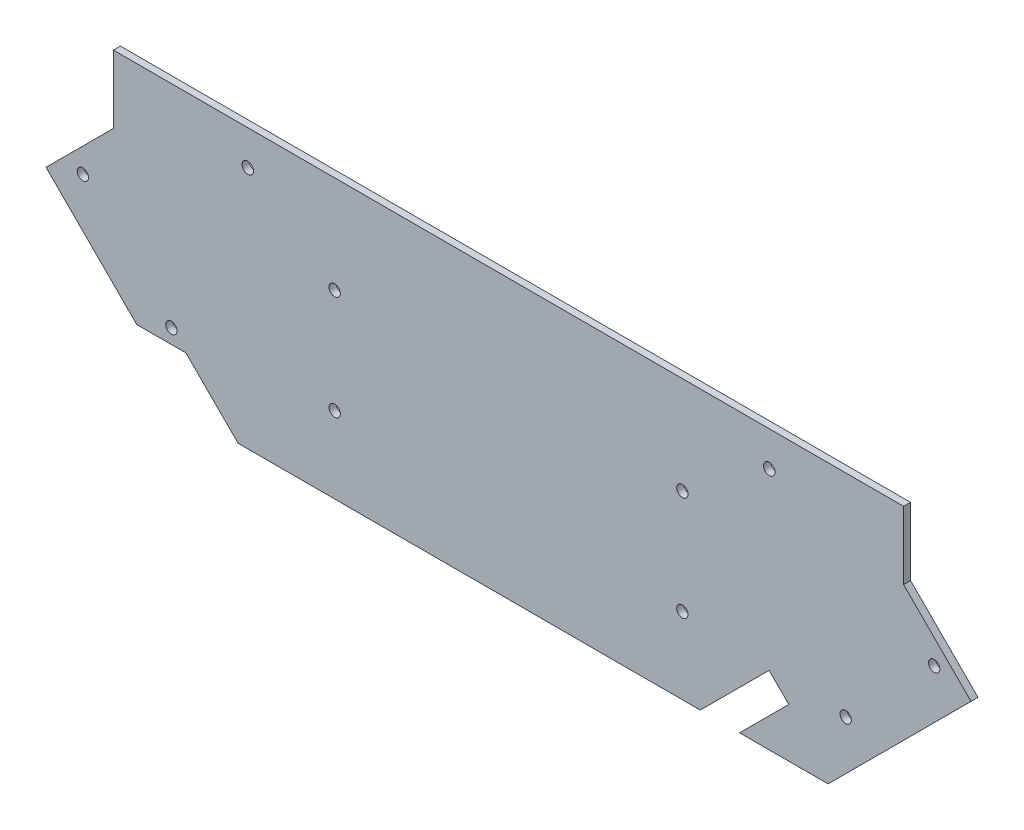
ISO-10303-21;
HEADER;
FILE_DESCRIPTION(('STEP AP214'),'2;1');
FILE_NAME('part.step','',(''),(''),'','','');
FILE_SCHEMA(('AUTOMOTIVE_DESIGN { 1 0 10303 214 1 1 1 1 }'));
ENDSEC;
DATA;
#1=APPLICATION_CONTEXT('core data for automotive mechanical design processes');
#2=APPLICATION_PROTOCOL_DEFINITION('international standard','automotive_design',2000,#1);
#3=PRODUCT_CONTEXT('',#1,'mechanical');
#4=PRODUCT('Part','Part','',(#3));
#5=PRODUCT_RELATED_PRODUCT_CATEGORY('part','',(#4));
#6=PRODUCT_DEFINITION_FORMATION('','',#4);
#7=PRODUCT_DEFINITION_CONTEXT('part definition',#1,'design');
#8=PRODUCT_DEFINITION('design','',#6,#7);
#9=PRODUCT_DEFINITION_SHAPE('','',#8);
#10=(LENGTH_UNIT() NAMED_UNIT(*) SI_UNIT(.MILLI.,.METRE.));
#11=(NAMED_UNIT(*) PLANE_ANGLE_UNIT() SI_UNIT($,.RADIAN.));
#12=(NAMED_UNIT(*) SI_UNIT($,.STERADIAN.) SOLID_ANGLE_UNIT());
#13=UNCERTAINTY_MEASURE_WITH_UNIT(LENGTH_MEASURE(1.E-05),#10,'distance_accuracy_value','');
#14=(GEOMETRIC_REPRESENTATION_CONTEXT(3) GLOBAL_UNCERTAINTY_ASSIGNED_CONTEXT((#13)) GLOBAL_UNIT_ASSIGNED_CONTEXT((#10,
#11,#12)) REPRESENTATION_CONTEXT('',''));
#15=CARTESIAN_POINT('',(0.,0.,0.));
#16=DIRECTION('',(0.,0.,1.));
#17=DIRECTION('',(1.,0.,0.));
#18=AXIS2_PLACEMENT_3D('',#15,#16,#17);
#19=CARTESIAN_POINT('',(63.63,-40.,2.));
#20=DIRECTION('',(0.,1.,0.));
#21=DIRECTION('',(-1.,0.,0.));
#22=AXIS2_PLACEMENT_3D('',#19,#20,#21);
#23=PLANE('',#22);
#24=DIRECTION('',(1.,0.,0.));
#25=VECTOR('',#24,1.);
#26=CARTESIAN_POINT('',(63.63,-40.,2.));
#27=LINE('',#26,#25);
#28=CARTESIAN_POINT('',(66.4584271247462,-40.0000000000003,2.));
#29=VERTEX_POINT('',#28);
#30=CARTESIAN_POINT('',(91.9142712474619,-40.,2.));
#31=VERTEX_POINT('',#30);
#32=EDGE_CURVE('E174',#29,#31,#27,.T.);
#33=ORIENTED_EDGE('',*,*,#32,.F.);
#34=DIRECTION('',(0.,0.,1.));
#35=VECTOR('',#34,1.);
#36=CARTESIAN_POINT('',(66.4584271247462,-40.0000000000003,-30.));
#37=LINE('',#36,#35);
#38=CARTESIAN_POINT('',(66.4584271247462,-40.0000000000003,0.));
#39=VERTEX_POINT('',#38);
#40=EDGE_CURVE('E291',#39,#29,#37,.T.);
#41=ORIENTED_EDGE('',*,*,#40,.F.);
#42=DIRECTION('',(1.,0.,0.));
#43=VECTOR('',#42,1.);
#44=CARTESIAN_POINT('',(63.63,-40.,0.));
#45=LINE('',#44,#43);
#46=CARTESIAN_POINT('',(91.9142712474619,-40.,0.));
#47=VERTEX_POINT('',#46);
#48=EDGE_CURVE('E178',#39,#47,#45,.T.);
#49=ORIENTED_EDGE('',*,*,#48,.T.);
#50=DIRECTION('',(0.,0.,-1.));
#51=VECTOR('',#50,1.);
#52=CARTESIAN_POINT('',(91.9142712474619,-40.,125.542469215234));
#53=LINE('',#52,#51);
#54=EDGE_CURVE('E241',#31,#47,#53,.T.);
#55=ORIENTED_EDGE('',*,*,#54,.F.);
#56=EDGE_LOOP('',(#33,#41,#49,#55));
#57=FACE_BOUND('',#56,.T.);
#58=ADVANCED_FACE('F36',(#57),#23,.F.);
#59=CARTESIAN_POINT('',(-77.772135623731,-40.,2.));
#60=VERTEX_POINT('',#59);
#61=CARTESIAN_POINT('',(55.1447186257614,-40.0000000000002,2.));
#62=VERTEX_POINT('',#61);
#63=EDGE_CURVE('E169',#60,#62,#27,.T.);
#64=ORIENTED_EDGE('',*,*,#63,.F.);
#65=DIRECTION('',(0.,0.,1.));
#66=VECTOR('',#65,1.);
#67=CARTESIAN_POINT('',(-77.772135623731,-40.,-30.));
#68=LINE('',#67,#66);
#69=CARTESIAN_POINT('',(-77.772135623731,-40.,0.));
#70=VERTEX_POINT('',#69);
#71=EDGE_CURVE('E276',#70,#60,#68,.T.);
#72=ORIENTED_EDGE('',*,*,#71,.F.);
#73=CARTESIAN_POINT('',(55.1447186257614,-40.0000000000002,0.));
#74=VERTEX_POINT('',#73);
#75=EDGE_CURVE('E180',#70,#74,#45,.T.);
#76=ORIENTED_EDGE('',*,*,#75,.T.);
#77=DIRECTION('',(0.,0.,1.));
#78=VECTOR('',#77,1.);
#79=CARTESIAN_POINT('',(55.1447186257614,-40.0000000000002,-30.));
#80=LINE('',#79,#78);
#81=EDGE_CURVE('E311',#74,#62,#80,.T.);
#82=ORIENTED_EDGE('',*,*,#81,.T.);
#83=EDGE_LOOP('',(#64,#72,#76,#82));
#84=FACE_BOUND('',#83,.T.);
#85=ADVANCED_FACE('F38',(#84),#23,.F.);
#86=CARTESIAN_POINT('',(63.63,40.,2.));
#87=DIRECTION('',(0.,-1.,0.));
#88=DIRECTION('',(1.,0.,0.));
#89=AXIS2_PLACEMENT_3D('',#86,#87,#88);
#90=PLANE('',#89);
#91=DIRECTION('',(-1.,0.,0.));
#92=VECTOR('',#91,1.);
#93=CARTESIAN_POINT('',(63.63,40.,2.));
#94=LINE('',#93,#92);
#95=CARTESIAN_POINT('',(113.63,40.,2.));
#96=VERTEX_POINT('',#95);
#97=CARTESIAN_POINT('',(-113.63,40.,2.));
#98=VERTEX_POINT('',#97);
#99=EDGE_CURVE('E157',#96,#98,#94,.T.);
#100=ORIENTED_EDGE('',*,*,#99,.F.);
#101=DIRECTION('',(0.,0.,1.));
#102=VECTOR('',#101,1.);
#103=CARTESIAN_POINT('',(113.63,40.,-30.));
#104=LINE('',#103,#102);
#105=CARTESIAN_POINT('',(113.63,40.,0.));
#106=VERTEX_POINT('',#105);
#107=EDGE_CURVE('E299',#106,#96,#104,.T.);
#108=ORIENTED_EDGE('',*,*,#107,.F.);
#109=DIRECTION('',(-1.,0.,0.));
#110=VECTOR('',#109,1.);
#111=CARTESIAN_POINT('',(63.63,40.,0.));
#112=LINE('',#111,#110);
#113=CARTESIAN_POINT('',(-113.63,40.,0.));
#114=VERTEX_POINT('',#113);
#115=EDGE_CURVE('E159',#106,#114,#112,.T.);
#116=ORIENTED_EDGE('',*,*,#115,.T.);
#117=DIRECTION('',(0.,0.,1.));
#118=VECTOR('',#117,1.);
#119=CARTESIAN_POINT('',(-113.63,40.,-30.));
#120=LINE('',#119,#118);
#121=EDGE_CURVE('E142',#114,#98,#120,.T.);
#122=ORIENTED_EDGE('',*,*,#121,.T.);
#123=EDGE_LOOP('',(#100,#108,#116,#122));
#124=FACE_BOUND('',#123,.T.);
#125=ADVANCED_FACE('F155',(#124),#90,.F.);
#126=CARTESIAN_POINT('',(0.,0.,2.));
#127=DIRECTION('',(0.,0.,1.));
#128=DIRECTION('',(1.,0.,0.));
#129=AXIS2_PLACEMENT_3D('',#126,#127,#128);
#130=PLANE('',#129);
#131=CARTESIAN_POINT('',(122.416796564404,4.64466094067265,2.));
#132=DIRECTION('',(0.,0.,1.));
#133=DIRECTION('',(-1.,0.,0.));
#134=AXIS2_PLACEMENT_3D('',#131,#132,#133);
#135=CIRCLE('',#134,1.62499999999997);
#136=CARTESIAN_POINT('',(120.791796564404,4.64466094067265,2.));
#137=VERTEX_POINT('',#136);
#138=EDGE_CURVE('E287',#137,#137,#135,.T.);
#139=ORIENTED_EDGE('',*,*,#138,.F.);
#140=EDGE_LOOP('',(#139));
#141=FACE_BOUND('',#140,.T.);
#142=CARTESIAN_POINT('',(96.9609524416879,-20.8111831820431,2.));
#143=DIRECTION('',(0.,0.,1.));
#144=DIRECTION('',(-1.,0.,0.));
#145=AXIS2_PLACEMENT_3D('',#142,#143,#144);
#146=CIRCLE('',#145,1.625);
#147=CARTESIAN_POINT('',(95.3359524416879,-20.8111831820431,2.));
#148=VERTEX_POINT('',#147);
#149=EDGE_CURVE('E290',#148,#148,#146,.T.);
#150=ORIENTED_EDGE('',*,*,#149,.F.);
#151=EDGE_LOOP('',(#150));
#152=FACE_BOUND('',#151,.T.);
#153=CARTESIAN_POINT('',(-122.416796564404,4.64466094067262,2.));
#154=DIRECTION('',(0.,0.,1.));
#155=DIRECTION('',(1.,0.,0.));
#156=AXIS2_PLACEMENT_3D('',#153,#154,#155);
#157=CIRCLE('',#156,1.62499999999997);
#158=CARTESIAN_POINT('',(-120.791796564404,4.64466094067262,2.));
#159=VERTEX_POINT('',#158);
#160=EDGE_CURVE('E294',#159,#159,#157,.T.);
#161=ORIENTED_EDGE('',*,*,#160,.F.);
#162=EDGE_LOOP('',(#161));
#163=FACE_BOUND('',#162,.T.);
#164=CARTESIAN_POINT('',(-96.9609524416879,-20.8111831820431,2.));
#165=DIRECTION('',(0.,0.,1.));
#166=DIRECTION('',(1.,0.,0.));
#167=AXIS2_PLACEMENT_3D('',#164,#165,#166);
#168=CIRCLE('',#167,1.625);
#169=CARTESIAN_POINT('',(-95.3359524416879,-20.8111831820431,2.));
#170=VERTEX_POINT('',#169);
#171=EDGE_CURVE('E284',#170,#170,#168,.T.);
#172=ORIENTED_EDGE('',*,*,#171,.F.);
#173=EDGE_LOOP('',(#172));
#174=FACE_BOUND('',#173,.T.);
#175=CARTESIAN_POINT('',(-50.,-18.,2.));
#176=DIRECTION('',(0.,0.,1.));
#177=DIRECTION('',(1.,0.,0.));
#178=AXIS2_PLACEMENT_3D('',#175,#176,#177);
#179=CIRCLE('',#178,1.625);
#180=CARTESIAN_POINT('',(-48.375,-18.,2.));
#181=VERTEX_POINT('',#180);
#182=EDGE_CURVE('E269',#181,#181,#179,.T.);
#183=ORIENTED_EDGE('',*,*,#182,.F.);
#184=EDGE_LOOP('',(#183));
#185=FACE_BOUND('',#184,.T.);
#186=CARTESIAN_POINT('',(50.,12.,2.));
#187=DIRECTION('',(0.,0.,1.));
#188=DIRECTION('',(1.,0.,0.));
#189=AXIS2_PLACEMENT_3D('',#186,#187,#188);
#190=CIRCLE('',#189,1.625);
#191=CARTESIAN_POINT('',(51.625,12.,2.));
#192=VERTEX_POINT('',#191);
#193=EDGE_CURVE('E270',#192,#192,#190,.T.);
#194=ORIENTED_EDGE('',*,*,#193,.F.);
#195=EDGE_LOOP('',(#194));
#196=FACE_BOUND('',#195,.T.);
#197=CARTESIAN_POINT('',(50.,-18.,2.));
#198=DIRECTION('',(0.,0.,1.));
#199=DIRECTION('',(1.,0.,0.));
#200=AXIS2_PLACEMENT_3D('',#197,#198,#199);
#201=CIRCLE('',#200,1.625);
#202=CARTESIAN_POINT('',(51.625,-18.,2.));
#203=VERTEX_POINT('',#202);
#204=EDGE_CURVE('E273',#203,#203,#201,.T.);
#205=ORIENTED_EDGE('',*,*,#204,.F.);
#206=EDGE_LOOP('',(#205));
#207=FACE_BOUND('',#206,.T.);
#208=DIRECTION('',(-1.,0.,0.));
#209=VECTOR('',#208,1.);
#210=CARTESIAN_POINT('',(-106.914271247462,-25.,2.));
#211=LINE('',#210,#209);
#212=CARTESIAN_POINT('',(-92.772135623731,-25.,2.));
#213=VERTEX_POINT('',#212);
#214=CARTESIAN_POINT('',(-106.914271247462,-25.,2.));
#215=VERTEX_POINT('',#214);
#216=EDGE_CURVE('E252',#213,#215,#211,.T.);
#217=ORIENTED_EDGE('',*,*,#216,.F.);
#218=DIRECTION('',(-0.707106781186548,0.707106781186547,0.));
#219=VECTOR('',#218,1.);
#220=CARTESIAN_POINT('',(-92.772135623731,-25.,2.));
#221=LINE('',#220,#219);
#222=EDGE_CURVE('E281',#60,#213,#221,.T.);
#223=ORIENTED_EDGE('',*,*,#222,.F.);
#224=ORIENTED_EDGE('',*,*,#63,.T.);
#225=DIRECTION('',(-0.707106781186551,-0.707106781186544,0.));
#226=VECTOR('',#225,1.);
#227=CARTESIAN_POINT('',(74.9437084989848,-20.201010126777,2.));
#228=LINE('',#227,#226);
#229=CARTESIAN_POINT('',(74.9437084989848,-20.201010126777,2.));
#230=VERTEX_POINT('',#229);
#231=EDGE_CURVE('E309',#230,#62,#228,.T.);
#232=ORIENTED_EDGE('',*,*,#231,.F.);
#233=DIRECTION('',(-0.707106781186543,0.707106781186552,0.));
#234=VECTOR('',#233,1.);
#235=CARTESIAN_POINT('',(80.6005627484772,-25.8578643762694,2.));
#236=LINE('',#235,#234);
#237=CARTESIAN_POINT('',(80.6005627484772,-25.8578643762694,2.));
#238=VERTEX_POINT('',#237);
#239=EDGE_CURVE('E316',#238,#230,#236,.T.);
#240=ORIENTED_EDGE('',*,*,#239,.F.);
#241=DIRECTION('',(0.707106781186551,0.707106781186544,0.));
#242=VECTOR('',#241,1.);
#243=CARTESIAN_POINT('',(66.4584271247462,-40.0000000000003,2.));
#244=LINE('',#243,#242);
#245=EDGE_CURVE('E304',#29,#238,#244,.T.);
#246=ORIENTED_EDGE('',*,*,#245,.F.);
#247=ORIENTED_EDGE('',*,*,#32,.T.);
#248=DIRECTION('',(-0.707106781186548,-0.707106781186547,0.));
#249=VECTOR('',#248,1.);
#250=CARTESIAN_POINT('',(65.9571356237309,-65.9571356237309,2.));
#251=LINE('',#250,#249);
#252=CARTESIAN_POINT('',(133.023398282202,1.10912703473992,2.));
#253=VERTEX_POINT('',#252);
#254=EDGE_CURVE('E233',#253,#31,#251,.T.);
#255=ORIENTED_EDGE('',*,*,#254,.F.);
#256=DIRECTION('',(0.707106781186548,-0.707106781186548,0.));
#257=VECTOR('',#256,1.);
#258=CARTESIAN_POINT('',(133.023398282202,1.10912703473992,2.));
#259=LINE('',#258,#257);
#260=CARTESIAN_POINT('',(113.63,20.5025253169417,2.));
#261=VERTEX_POINT('',#260);
#262=EDGE_CURVE('E302',#261,#253,#259,.T.);
#263=ORIENTED_EDGE('',*,*,#262,.F.);
#264=DIRECTION('',(0.,-1.,0.));
#265=VECTOR('',#264,1.);
#266=CARTESIAN_POINT('',(113.63,20.5025253169417,2.));
#267=LINE('',#266,#265);
#268=EDGE_CURVE('E167',#96,#261,#267,.T.);
#269=ORIENTED_EDGE('',*,*,#268,.F.);
#270=ORIENTED_EDGE('',*,*,#99,.T.);
#271=DIRECTION('',(0.,1.,0.));
#272=VECTOR('',#271,1.);
#273=CARTESIAN_POINT('',(-113.63,20.5025253169417,2.));
#274=LINE('',#273,#272);
#275=CARTESIAN_POINT('',(-113.63,20.5025253169417,2.));
#276=VERTEX_POINT('',#275);
#277=EDGE_CURVE('E139',#276,#98,#274,.T.);
#278=ORIENTED_EDGE('',*,*,#277,.F.);
#279=DIRECTION('',(0.707106781186548,0.707106781186548,0.));
#280=VECTOR('',#279,1.);
#281=CARTESIAN_POINT('',(-133.023398282202,1.10912703473989,2.));
#282=LINE('',#281,#280);
#283=CARTESIAN_POINT('',(-133.023398282202,1.10912703473989,2.));
#284=VERTEX_POINT('',#283);
#285=EDGE_CURVE('E149',#284,#276,#282,.T.);
#286=ORIENTED_EDGE('',*,*,#285,.F.);
#287=DIRECTION('',(0.707106781186548,-0.707106781186548,0.));
#288=VECTOR('',#287,1.);
#289=CARTESIAN_POINT('',(-65.957135623731,-65.957135623731,2.));
#290=LINE('',#289,#288);
#291=EDGE_CURVE('E181',#284,#215,#290,.T.);
#292=ORIENTED_EDGE('',*,*,#291,.T.);
#293=EDGE_LOOP('',(#217,#223,#224,#232,#240,#246,#247,#255,#263,#269,#270,#278,#286,#292));
#294=FACE_BOUND('',#293,.T.);
#295=CARTESIAN_POINT('',(-75.,30.,2.));
#296=DIRECTION('',(0.,0.,1.));
#297=DIRECTION('',(1.,0.,0.));
#298=AXIS2_PLACEMENT_3D('',#295,#296,#297);
#299=CIRCLE('',#298,1.65);
#300=CARTESIAN_POINT('',(-73.35,30.,2.));
#301=VERTEX_POINT('',#300);
#302=EDGE_CURVE('E321',#301,#301,#299,.T.);
#303=ORIENTED_EDGE('',*,*,#302,.F.);
#304=EDGE_LOOP('',(#303));
#305=FACE_BOUND('',#304,.T.);
#306=CARTESIAN_POINT('',(75.,30.,2.));
#307=DIRECTION('',(0.,0.,1.));
#308=DIRECTION('',(1.,0.,0.));
#309=AXIS2_PLACEMENT_3D('',#306,#307,#308);
#310=CIRCLE('',#309,1.65);
#311=CARTESIAN_POINT('',(76.65,30.,2.));
#312=VERTEX_POINT('',#311);
#313=EDGE_CURVE('E150',#312,#312,#310,.T.);
#314=ORIENTED_EDGE('',*,*,#313,.F.);
#315=EDGE_LOOP('',(#314));
#316=FACE_BOUND('',#315,.T.);
#317=CARTESIAN_POINT('',(-50.,12.,2.));
#318=DIRECTION('',(0.,0.,1.));
#319=DIRECTION('',(1.,0.,0.));
#320=AXIS2_PLACEMENT_3D('',#317,#318,#319);
#321=CIRCLE('',#320,1.625);
#322=CARTESIAN_POINT('',(-48.375,12.,2.));
#323=VERTEX_POINT('',#322);
#324=EDGE_CURVE('E264',#323,#323,#321,.T.);
#325=ORIENTED_EDGE('',*,*,#324,.F.);
#326=EDGE_LOOP('',(#325));
#327=FACE_BOUND('',#326,.T.);
#328=ADVANCED_FACE('F163',(#141,#152,#163,#174,#185,#196,#207,#294,#305,#316,#327),#130,.T.);
#329=CARTESIAN_POINT('',(0.,0.,0.));
#330=DIRECTION('',(0.,0.,1.));
#331=DIRECTION('',(1.,0.,0.));
#332=AXIS2_PLACEMENT_3D('',#329,#330,#331);
#333=PLANE('',#332);
#334=CARTESIAN_POINT('',(122.416796564404,4.64466094067265,0.));
#335=DIRECTION('',(0.,0.,1.));
#336=DIRECTION('',(1.,0.,0.));
#337=AXIS2_PLACEMENT_3D('',#334,#335,#336);
#338=CIRCLE('',#337,1.62499999999997);
#339=CARTESIAN_POINT('',(124.041796564404,4.64466094067265,0.));
#340=VERTEX_POINT('',#339);
#341=EDGE_CURVE('E40',#340,#340,#338,.T.);
#342=ORIENTED_EDGE('',*,*,#341,.T.);
#343=EDGE_LOOP('',(#342));
#344=FACE_BOUND('',#343,.T.);
#345=CARTESIAN_POINT('',(96.9609524416879,-20.8111831820431,0.));
#346=DIRECTION('',(0.,0.,1.));
#347=DIRECTION('',(1.,0.,0.));
#348=AXIS2_PLACEMENT_3D('',#345,#346,#347);
#349=CIRCLE('',#348,1.625);
#350=CARTESIAN_POINT('',(98.5859524416879,-20.8111831820431,0.));
#351=VERTEX_POINT('',#350);
#352=EDGE_CURVE('E224',#351,#351,#349,.T.);
#353=ORIENTED_EDGE('',*,*,#352,.T.);
#354=EDGE_LOOP('',(#353));
#355=FACE_BOUND('',#354,.T.);
#356=CARTESIAN_POINT('',(-122.416796564404,4.64466094067262,0.));
#357=DIRECTION('',(0.,0.,1.));
#358=DIRECTION('',(1.,0.,0.));
#359=AXIS2_PLACEMENT_3D('',#356,#357,#358);
#360=CIRCLE('',#359,1.62499999999997);
#361=CARTESIAN_POINT('',(-120.791796564404,4.64466094067262,0.));
#362=VERTEX_POINT('',#361);
#363=EDGE_CURVE('E222',#362,#362,#360,.T.);
#364=ORIENTED_EDGE('',*,*,#363,.T.);
#365=EDGE_LOOP('',(#364));
#366=FACE_BOUND('',#365,.T.);
#367=CARTESIAN_POINT('',(-96.9609524416879,-20.8111831820431,0.));
#368=DIRECTION('',(0.,0.,1.));
#369=DIRECTION('',(1.,0.,0.));
#370=AXIS2_PLACEMENT_3D('',#367,#368,#369);
#371=CIRCLE('',#370,1.625);
#372=CARTESIAN_POINT('',(-95.3359524416879,-20.8111831820431,0.));
#373=VERTEX_POINT('',#372);
#374=EDGE_CURVE('E219',#373,#373,#371,.T.);
#375=ORIENTED_EDGE('',*,*,#374,.T.);
#376=EDGE_LOOP('',(#375));
#377=FACE_BOUND('',#376,.T.);
#378=CARTESIAN_POINT('',(-50.,-18.,0.));
#379=DIRECTION('',(0.,0.,1.));
#380=DIRECTION('',(1.,0.,0.));
#381=AXIS2_PLACEMENT_3D('',#378,#379,#380);
#382=CIRCLE('',#381,1.625);
#383=CARTESIAN_POINT('',(-48.375,-18.,0.));
#384=VERTEX_POINT('',#383);
#385=EDGE_CURVE('E216',#384,#384,#382,.T.);
#386=ORIENTED_EDGE('',*,*,#385,.T.);
#387=EDGE_LOOP('',(#386));
#388=FACE_BOUND('',#387,.T.);
#389=CARTESIAN_POINT('',(50.,12.,0.));
#390=DIRECTION('',(0.,0.,1.));
#391=DIRECTION('',(1.,0.,0.));
#392=AXIS2_PLACEMENT_3D('',#389,#390,#391);
#393=CIRCLE('',#392,1.625);
#394=CARTESIAN_POINT('',(51.625,12.,0.));
#395=VERTEX_POINT('',#394);
#396=EDGE_CURVE('E213',#395,#395,#393,.T.);
#397=ORIENTED_EDGE('',*,*,#396,.T.);
#398=EDGE_LOOP('',(#397));
#399=FACE_BOUND('',#398,.T.);
#400=CARTESIAN_POINT('',(50.,-18.,0.));
#401=DIRECTION('',(0.,0.,1.));
#402=DIRECTION('',(1.,0.,0.));
#403=AXIS2_PLACEMENT_3D('',#400,#401,#402);
#404=CIRCLE('',#403,1.625);
#405=CARTESIAN_POINT('',(51.625,-18.,0.));
#406=VERTEX_POINT('',#405);
#407=EDGE_CURVE('E209',#406,#406,#404,.T.);
#408=ORIENTED_EDGE('',*,*,#407,.T.);
#409=EDGE_LOOP('',(#408));
#410=FACE_BOUND('',#409,.T.);
#411=CARTESIAN_POINT('',(-75.,30.,0.));
#412=DIRECTION('',(0.,0.,1.));
#413=DIRECTION('',(1.,0.,0.));
#414=AXIS2_PLACEMENT_3D('',#411,#412,#413);
#415=CIRCLE('',#414,1.65);
#416=CARTESIAN_POINT('',(-73.35,30.,0.));
#417=VERTEX_POINT('',#416);
#418=EDGE_CURVE('E195',#417,#417,#415,.T.);
#419=ORIENTED_EDGE('',*,*,#418,.T.);
#420=EDGE_LOOP('',(#419));
#421=FACE_BOUND('',#420,.T.);
#422=DIRECTION('',(-0.707106781186548,0.707106781186547,0.));
#423=VECTOR('',#422,1.);
#424=CARTESIAN_POINT('',(-58.8860678118655,-58.8860678118655,0.));
#425=LINE('',#424,#423);
#426=CARTESIAN_POINT('',(-92.772135623731,-25.,0.));
#427=VERTEX_POINT('',#426);
#428=EDGE_CURVE('E11',#70,#427,#425,.T.);
#429=ORIENTED_EDGE('',*,*,#428,.T.);
#430=DIRECTION('',(-1.,0.,0.));
#431=VECTOR('',#430,1.);
#432=CARTESIAN_POINT('',(0.,-25.0000000000001,0.));
#433=LINE('',#432,#431);
#434=CARTESIAN_POINT('',(-106.914271247462,-25.,0.));
#435=VERTEX_POINT('',#434);
#436=EDGE_CURVE('E192',#427,#435,#433,.T.);
#437=ORIENTED_EDGE('',*,*,#436,.T.);
#438=DIRECTION('',(0.707106781186548,-0.707106781186548,0.));
#439=VECTOR('',#438,1.);
#440=CARTESIAN_POINT('',(-65.957135623731,-65.957135623731,0.));
#441=LINE('',#440,#439);
#442=CARTESIAN_POINT('',(-133.023398282202,1.10912703473989,0.));
#443=VERTEX_POINT('',#442);
#444=EDGE_CURVE('E247',#443,#435,#441,.T.);
#445=ORIENTED_EDGE('',*,*,#444,.F.);
#446=DIRECTION('',(0.707106781186547,0.707106781186548,0.));
#447=VECTOR('',#446,1.);
#448=CARTESIAN_POINT('',(-67.0662626584709,67.0662626584709,0.));
#449=LINE('',#448,#447);
#450=CARTESIAN_POINT('',(-113.63,20.5025253169417,0.));
#451=VERTEX_POINT('',#450);
#452=EDGE_CURVE('E61',#443,#451,#449,.T.);
#453=ORIENTED_EDGE('',*,*,#452,.T.);
#454=DIRECTION('',(0.,1.,0.));
#455=VECTOR('',#454,1.);
#456=CARTESIAN_POINT('',(-113.63,0.,0.));
#457=LINE('',#456,#455);
#458=EDGE_CURVE('E187',#451,#114,#457,.T.);
#459=ORIENTED_EDGE('',*,*,#458,.T.);
#460=ORIENTED_EDGE('',*,*,#115,.F.);
#461=DIRECTION('',(0.,-1.,0.));
#462=VECTOR('',#461,1.);
#463=CARTESIAN_POINT('',(113.63,0.,0.));
#464=LINE('',#463,#462);
#465=CARTESIAN_POINT('',(113.63,20.5025253169417,0.));
#466=VERTEX_POINT('',#465);
#467=EDGE_CURVE('E197',#106,#466,#464,.T.);
#468=ORIENTED_EDGE('',*,*,#467,.T.);
#469=DIRECTION('',(0.707106781186548,-0.707106781186548,0.));
#470=VECTOR('',#469,1.);
#471=CARTESIAN_POINT('',(67.0662626584709,67.0662626584709,0.));
#472=LINE('',#471,#470);
#473=CARTESIAN_POINT('',(133.023398282202,1.10912703473992,0.));
#474=VERTEX_POINT('',#473);
#475=EDGE_CURVE('E263',#466,#474,#472,.T.);
#476=ORIENTED_EDGE('',*,*,#475,.T.);
#477=DIRECTION('',(-0.707106781186548,-0.707106781186547,0.));
#478=VECTOR('',#477,1.);
#479=CARTESIAN_POINT('',(65.9571356237309,-65.9571356237309,0.));
#480=LINE('',#479,#478);
#481=EDGE_CURVE('E229',#474,#47,#480,.T.);
#482=ORIENTED_EDGE('',*,*,#481,.T.);
#483=ORIENTED_EDGE('',*,*,#48,.F.);
#484=DIRECTION('',(0.707106781186551,0.707106781186544,0.));
#485=VECTOR('',#484,1.);
#486=CARTESIAN_POINT('',(53.2292135623729,-53.2292135623734,0.));
#487=LINE('',#486,#485);
#488=CARTESIAN_POINT('',(80.6005627484772,-25.8578643762694,0.));
#489=VERTEX_POINT('',#488);
#490=EDGE_CURVE('E45',#39,#489,#487,.T.);
#491=ORIENTED_EDGE('',*,*,#490,.T.);
#492=DIRECTION('',(-0.707106781186543,0.707106781186552,0.));
#493=VECTOR('',#492,1.);
#494=CARTESIAN_POINT('',(27.3713491861044,27.371349186104,0.));
#495=LINE('',#494,#493);
#496=CARTESIAN_POINT('',(74.9437084989848,-20.201010126777,0.));
#497=VERTEX_POINT('',#496);
#498=EDGE_CURVE('E200',#489,#497,#495,.T.);
#499=ORIENTED_EDGE('',*,*,#498,.T.);
#500=DIRECTION('',(-0.707106781186551,-0.707106781186544,0.));
#501=VECTOR('',#500,1.);
#502=CARTESIAN_POINT('',(47.5723593128806,-47.572359312881,0.));
#503=LINE('',#502,#501);
#504=EDGE_CURVE('E203',#497,#74,#503,.T.);
#505=ORIENTED_EDGE('',*,*,#504,.T.);
#506=ORIENTED_EDGE('',*,*,#75,.F.);
#507=EDGE_LOOP('',(#429,#437,#445,#453,#459,#460,#468,#476,#482,#483,#491,#499,#505,#506));
#508=FACE_BOUND('',#507,.T.);
#509=CARTESIAN_POINT('',(75.,30.,0.));
#510=DIRECTION('',(0.,0.,1.));
#511=DIRECTION('',(1.,0.,0.));
#512=AXIS2_PLACEMENT_3D('',#509,#510,#511);
#513=CIRCLE('',#512,1.65);
#514=CARTESIAN_POINT('',(76.65,30.,0.));
#515=VERTEX_POINT('',#514);
#516=EDGE_CURVE('E191',#515,#515,#513,.T.);
#517=ORIENTED_EDGE('',*,*,#516,.T.);
#518=EDGE_LOOP('',(#517));
#519=FACE_BOUND('',#518,.T.);
#520=CARTESIAN_POINT('',(-50.,12.,0.));
#521=DIRECTION('',(0.,0.,1.));
#522=DIRECTION('',(1.,0.,0.));
#523=AXIS2_PLACEMENT_3D('',#520,#521,#522);
#524=CIRCLE('',#523,1.625);
#525=CARTESIAN_POINT('',(-48.375,12.,0.));
#526=VERTEX_POINT('',#525);
#527=EDGE_CURVE('E188',#526,#526,#524,.T.);
#528=ORIENTED_EDGE('',*,*,#527,.T.);
#529=EDGE_LOOP('',(#528));
#530=FACE_BOUND('',#529,.T.);
#531=ADVANCED_FACE('F260',(#344,#355,#366,#377,#388,#399,#410,#421,#508,#519,#530),#333,.F.);
#532=CARTESIAN_POINT('',(-65.957135623731,-65.957135623731,125.542469215234));
#533=DIRECTION('',(0.707106781186547,0.707106781186547,0.));
#534=DIRECTION('',(-0.707106781186548,0.707106781186548,0.));
#535=AXIS2_PLACEMENT_3D('',#532,#533,#534);
#536=PLANE('',#535);
#537=ORIENTED_EDGE('',*,*,#444,.T.);
#538=DIRECTION('',(0.,0.,1.));
#539=VECTOR('',#538,1.);
#540=CARTESIAN_POINT('',(-106.914271247462,-25.,125.542469215234));
#541=LINE('',#540,#539);
#542=EDGE_CURVE('E184',#435,#215,#541,.T.);
#543=ORIENTED_EDGE('',*,*,#542,.T.);
#544=ORIENTED_EDGE('',*,*,#291,.F.);
#545=DIRECTION('',(0.,0.,-1.));
#546=VECTOR('',#545,1.);
#547=CARTESIAN_POINT('',(-133.023398282202,1.10912703473989,125.542469215234));
#548=LINE('',#547,#546);
#549=EDGE_CURVE('E171',#284,#443,#548,.T.);
#550=ORIENTED_EDGE('',*,*,#549,.T.);
#551=EDGE_LOOP('',(#537,#543,#544,#550));
#552=FACE_BOUND('',#551,.T.);
#553=ADVANCED_FACE('F254',(#552),#536,.F.);
#554=CARTESIAN_POINT('',(65.9571356237309,-65.9571356237309,125.542469215234));
#555=DIRECTION('',(0.707106781186547,-0.707106781186548,0.));
#556=DIRECTION('',(0.707106781186548,0.707106781186547,0.));
#557=AXIS2_PLACEMENT_3D('',#554,#555,#556);
#558=PLANE('',#557);
#559=DIRECTION('',(0.,0.,-1.));
#560=VECTOR('',#559,1.);
#561=CARTESIAN_POINT('',(133.023398282202,1.10912703473992,125.542469215234));
#562=LINE('',#561,#560);
#563=EDGE_CURVE('E168',#253,#474,#562,.T.);
#564=ORIENTED_EDGE('',*,*,#563,.F.);
#565=ORIENTED_EDGE('',*,*,#254,.T.);
#566=ORIENTED_EDGE('',*,*,#54,.T.);
#567=ORIENTED_EDGE('',*,*,#481,.F.);
#568=EDGE_LOOP('',(#564,#565,#566,#567));
#569=FACE_BOUND('',#568,.T.);
#570=ADVANCED_FACE('F350',(#569),#558,.T.);
#571=CARTESIAN_POINT('',(113.63,20.5025253169417,-30.));
#572=DIRECTION('',(-1.,0.,0.));
#573=DIRECTION('',(0.,0.,1.));
#574=AXIS2_PLACEMENT_3D('',#571,#572,#573);
#575=PLANE('',#574);
#576=ORIENTED_EDGE('',*,*,#107,.T.);
#577=ORIENTED_EDGE('',*,*,#268,.T.);
#578=DIRECTION('',(0.,0.,1.));
#579=VECTOR('',#578,1.);
#580=CARTESIAN_POINT('',(113.63,20.5025253169417,-30.));
#581=LINE('',#580,#579);
#582=EDGE_CURVE('E301',#466,#261,#581,.T.);
#583=ORIENTED_EDGE('',*,*,#582,.F.);
#584=ORIENTED_EDGE('',*,*,#467,.F.);
#585=EDGE_LOOP('',(#576,#577,#583,#584));
#586=FACE_BOUND('',#585,.T.);
#587=ADVANCED_FACE('F370',(#586),#575,.F.);
#588=CARTESIAN_POINT('',(133.023398282202,1.10912703473992,-30.));
#589=DIRECTION('',(-0.707106781186548,-0.707106781186548,0.));
#590=DIRECTION('',(0.707106781186548,-0.707106781186548,0.));
#591=AXIS2_PLACEMENT_3D('',#588,#589,#590);
#592=PLANE('',#591);
#593=ORIENTED_EDGE('',*,*,#582,.T.);
#594=ORIENTED_EDGE('',*,*,#262,.T.);
#595=ORIENTED_EDGE('',*,*,#563,.T.);
#596=ORIENTED_EDGE('',*,*,#475,.F.);
#597=EDGE_LOOP('',(#593,#594,#595,#596));
#598=FACE_BOUND('',#597,.T.);
#599=ADVANCED_FACE('F367',(#598),#592,.F.);
#600=CARTESIAN_POINT('',(-113.63,20.5025253169417,-30.));
#601=DIRECTION('',(1.,0.,0.));
#602=DIRECTION('',(0.,0.,-1.));
#603=AXIS2_PLACEMENT_3D('',#600,#601,#602);
#604=PLANE('',#603);
#605=DIRECTION('',(0.,0.,1.));
#606=VECTOR('',#605,1.);
#607=CARTESIAN_POINT('',(-113.63,20.5025253169417,-30.));
#608=LINE('',#607,#606);
#609=EDGE_CURVE('E144',#451,#276,#608,.T.);
#610=ORIENTED_EDGE('',*,*,#609,.T.);
#611=ORIENTED_EDGE('',*,*,#277,.T.);
#612=ORIENTED_EDGE('',*,*,#121,.F.);
#613=ORIENTED_EDGE('',*,*,#458,.F.);
#614=EDGE_LOOP('',(#610,#611,#612,#613));
#615=FACE_BOUND('',#614,.T.);
#616=ADVANCED_FACE('F141',(#615),#604,.F.);
#617=CARTESIAN_POINT('',(-133.023398282202,1.10912703473989,-30.));
#618=DIRECTION('',(0.707106781186548,-0.707106781186548,0.));
#619=DIRECTION('',(0.707106781186547,0.707106781186548,0.));
#620=AXIS2_PLACEMENT_3D('',#617,#618,#619);
#621=PLANE('',#620);
#622=ORIENTED_EDGE('',*,*,#549,.F.);
#623=ORIENTED_EDGE('',*,*,#285,.T.);
#624=ORIENTED_EDGE('',*,*,#609,.F.);
#625=ORIENTED_EDGE('',*,*,#452,.F.);
#626=EDGE_LOOP('',(#622,#623,#624,#625));
#627=FACE_BOUND('',#626,.T.);
#628=ADVANCED_FACE('F408',(#627),#621,.F.);
#629=CARTESIAN_POINT('',(-92.772135623731,-25.,-30.));
#630=DIRECTION('',(0.707106781186547,0.707106781186548,0.));
#631=DIRECTION('',(-0.707106781186548,0.707106781186547,0.));
#632=AXIS2_PLACEMENT_3D('',#629,#630,#631);
#633=PLANE('',#632);
#634=ORIENTED_EDGE('',*,*,#71,.T.);
#635=ORIENTED_EDGE('',*,*,#222,.T.);
#636=DIRECTION('',(0.,0.,1.));
#637=VECTOR('',#636,1.);
#638=CARTESIAN_POINT('',(-92.772135623731,-25.,-30.));
#639=LINE('',#638,#637);
#640=EDGE_CURVE('E278',#427,#213,#639,.T.);
#641=ORIENTED_EDGE('',*,*,#640,.F.);
#642=ORIENTED_EDGE('',*,*,#428,.F.);
#643=EDGE_LOOP('',(#634,#635,#641,#642));
#644=FACE_BOUND('',#643,.T.);
#645=ADVANCED_FACE('F405',(#644),#633,.F.);
#646=CARTESIAN_POINT('',(-106.914271247462,-25.,-30.));
#647=DIRECTION('',(0.,1.,0.));
#648=DIRECTION('',(-1.,0.,0.));
#649=AXIS2_PLACEMENT_3D('',#646,#647,#648);
#650=PLANE('',#649);
#651=ORIENTED_EDGE('',*,*,#640,.T.);
#652=ORIENTED_EDGE('',*,*,#216,.T.);
#653=ORIENTED_EDGE('',*,*,#542,.F.);
#654=ORIENTED_EDGE('',*,*,#436,.F.);
#655=EDGE_LOOP('',(#651,#652,#653,#654));
#656=FACE_BOUND('',#655,.T.);
#657=ADVANCED_FACE('F258',(#656),#650,.F.);
#658=CARTESIAN_POINT('',(-50.,12.,-30.));
#659=DIRECTION('',(0.,0.,1.));
#660=DIRECTION('',(1.,0.,0.));
#661=AXIS2_PLACEMENT_3D('',#658,#659,#660);
#662=CYLINDRICAL_SURFACE('',#661,1.625);
#663=ORIENTED_EDGE('',*,*,#324,.T.);
#664=EDGE_LOOP('',(#663));
#665=FACE_BOUND('',#664,.T.);
#666=ORIENTED_EDGE('',*,*,#527,.F.);
#667=EDGE_LOOP('',(#666));
#668=FACE_BOUND('',#667,.T.);
#669=ADVANCED_FACE('F338',(#665,#668),#662,.F.);
#670=CARTESIAN_POINT('',(75.,30.,-30.));
#671=DIRECTION('',(0.,0.,1.));
#672=DIRECTION('',(1.,0.,0.));
#673=AXIS2_PLACEMENT_3D('',#670,#671,#672);
#674=CYLINDRICAL_SURFACE('',#673,1.65);
#675=ORIENTED_EDGE('',*,*,#313,.T.);
#676=EDGE_LOOP('',(#675));
#677=FACE_BOUND('',#676,.T.);
#678=ORIENTED_EDGE('',*,*,#516,.F.);
#679=EDGE_LOOP('',(#678));
#680=FACE_BOUND('',#679,.T.);
#681=ADVANCED_FACE('F341',(#677,#680),#674,.F.);
#682=CARTESIAN_POINT('',(66.4584271247462,-40.0000000000003,-30.));
#683=DIRECTION('',(0.707106781186544,-0.707106781186551,0.));
#684=DIRECTION('',(0.707106781186551,0.707106781186544,0.));
#685=AXIS2_PLACEMENT_3D('',#682,#683,#684);
#686=PLANE('',#685);
#687=ORIENTED_EDGE('',*,*,#40,.T.);
#688=ORIENTED_EDGE('',*,*,#245,.T.);
#689=DIRECTION('',(0.,0.,1.));
#690=VECTOR('',#689,1.);
#691=CARTESIAN_POINT('',(80.6005627484772,-25.8578643762694,-30.));
#692=LINE('',#691,#690);
#693=EDGE_CURVE('E307',#489,#238,#692,.T.);
#694=ORIENTED_EDGE('',*,*,#693,.F.);
#695=ORIENTED_EDGE('',*,*,#490,.F.);
#696=EDGE_LOOP('',(#687,#688,#694,#695));
#697=FACE_BOUND('',#696,.T.);
#698=ADVANCED_FACE('F440',(#697),#686,.F.);
#699=CARTESIAN_POINT('',(74.9437084989848,-20.201010126777,-30.));
#700=DIRECTION('',(-0.707106781186544,0.707106781186551,0.));
#701=DIRECTION('',(-0.707106781186551,-0.707106781186544,0.));
#702=AXIS2_PLACEMENT_3D('',#699,#700,#701);
#703=PLANE('',#702);
#704=DIRECTION('',(0.,0.,1.));
#705=VECTOR('',#704,1.);
#706=CARTESIAN_POINT('',(74.9437084989848,-20.201010126777,-30.));
#707=LINE('',#706,#705);
#708=EDGE_CURVE('E53',#497,#230,#707,.T.);
#709=ORIENTED_EDGE('',*,*,#708,.T.);
#710=ORIENTED_EDGE('',*,*,#231,.T.);
#711=ORIENTED_EDGE('',*,*,#81,.F.);
#712=ORIENTED_EDGE('',*,*,#504,.F.);
#713=EDGE_LOOP('',(#709,#710,#711,#712));
#714=FACE_BOUND('',#713,.T.);
#715=ADVANCED_FACE('F431',(#714),#703,.F.);
#716=CARTESIAN_POINT('',(80.6005627484772,-25.8578643762694,-30.));
#717=DIRECTION('',(0.707106781186552,0.707106781186543,0.));
#718=DIRECTION('',(-0.707106781186543,0.707106781186552,0.));
#719=AXIS2_PLACEMENT_3D('',#716,#717,#718);
#720=PLANE('',#719);
#721=ORIENTED_EDGE('',*,*,#693,.T.);
#722=ORIENTED_EDGE('',*,*,#239,.T.);
#723=ORIENTED_EDGE('',*,*,#708,.F.);
#724=ORIENTED_EDGE('',*,*,#498,.F.);
#725=EDGE_LOOP('',(#721,#722,#723,#724));
#726=FACE_BOUND('',#725,.T.);
#727=ADVANCED_FACE('F426',(#726),#720,.F.);
#728=CARTESIAN_POINT('',(-75.,30.,-30.));
#729=DIRECTION('',(0.,0.,1.));
#730=DIRECTION('',(1.,0.,0.));
#731=AXIS2_PLACEMENT_3D('',#728,#729,#730);
#732=CYLINDRICAL_SURFACE('',#731,1.65);
#733=ORIENTED_EDGE('',*,*,#302,.T.);
#734=EDGE_LOOP('',(#733));
#735=FACE_BOUND('',#734,.T.);
#736=ORIENTED_EDGE('',*,*,#418,.F.);
#737=EDGE_LOOP('',(#736));
#738=FACE_BOUND('',#737,.T.);
#739=ADVANCED_FACE('F328',(#735,#738),#732,.F.);
#740=CARTESIAN_POINT('',(50.,-18.,-30.));
#741=DIRECTION('',(0.,0.,1.));
#742=DIRECTION('',(1.,0.,0.));
#743=AXIS2_PLACEMENT_3D('',#740,#741,#742);
#744=CYLINDRICAL_SURFACE('',#743,1.625);
#745=ORIENTED_EDGE('',*,*,#204,.T.);
#746=EDGE_LOOP('',(#745));
#747=FACE_BOUND('',#746,.T.);
#748=ORIENTED_EDGE('',*,*,#407,.F.);
#749=EDGE_LOOP('',(#748));
#750=FACE_BOUND('',#749,.T.);
#751=ADVANCED_FACE('F398',(#747,#750),#744,.F.);
#752=CARTESIAN_POINT('',(50.,12.,-30.));
#753=DIRECTION('',(0.,0.,1.));
#754=DIRECTION('',(1.,0.,0.));
#755=AXIS2_PLACEMENT_3D('',#752,#753,#754);
#756=CYLINDRICAL_SURFACE('',#755,1.625);
#757=ORIENTED_EDGE('',*,*,#193,.T.);
#758=EDGE_LOOP('',(#757));
#759=FACE_BOUND('',#758,.T.);
#760=ORIENTED_EDGE('',*,*,#396,.F.);
#761=EDGE_LOOP('',(#760));
#762=FACE_BOUND('',#761,.T.);
#763=ADVANCED_FACE('F401',(#759,#762),#756,.F.);
#764=CARTESIAN_POINT('',(-50.,-18.,-30.));
#765=DIRECTION('',(0.,0.,1.));
#766=DIRECTION('',(1.,0.,0.));
#767=AXIS2_PLACEMENT_3D('',#764,#765,#766);
#768=CYLINDRICAL_SURFACE('',#767,1.625);
#769=ORIENTED_EDGE('',*,*,#182,.T.);
#770=EDGE_LOOP('',(#769));
#771=FACE_BOUND('',#770,.T.);
#772=ORIENTED_EDGE('',*,*,#385,.F.);
#773=EDGE_LOOP('',(#772));
#774=FACE_BOUND('',#773,.T.);
#775=ADVANCED_FACE('F385',(#771,#774),#768,.F.);
#776=CARTESIAN_POINT('',(-96.9609524416879,-20.8111831820431,-30.));
#777=DIRECTION('',(0.,0.,1.));
#778=DIRECTION('',(1.,0.,0.));
#779=AXIS2_PLACEMENT_3D('',#776,#777,#778);
#780=CYLINDRICAL_SURFACE('',#779,1.625);
#781=ORIENTED_EDGE('',*,*,#171,.T.);
#782=EDGE_LOOP('',(#781));
#783=FACE_BOUND('',#782,.T.);
#784=ORIENTED_EDGE('',*,*,#374,.F.);
#785=EDGE_LOOP('',(#784));
#786=FACE_BOUND('',#785,.T.);
#787=ADVANCED_FACE('F381',(#783,#786),#780,.F.);
#788=CARTESIAN_POINT('',(-122.416796564404,4.64466094067262,-30.));
#789=DIRECTION('',(0.,0.,1.));
#790=DIRECTION('',(1.,0.,0.));
#791=AXIS2_PLACEMENT_3D('',#788,#789,#790);
#792=CYLINDRICAL_SURFACE('',#791,1.62499999999997);
#793=ORIENTED_EDGE('',*,*,#160,.T.);
#794=EDGE_LOOP('',(#793));
#795=FACE_BOUND('',#794,.T.);
#796=ORIENTED_EDGE('',*,*,#363,.F.);
#797=EDGE_LOOP('',(#796));
#798=FACE_BOUND('',#797,.T.);
#799=ADVANCED_FACE('F384',(#795,#798),#792,.F.);
#800=CARTESIAN_POINT('',(96.9609524416879,-20.8111831820431,-30.));
#801=DIRECTION('',(0.,0.,1.));
#802=DIRECTION('',(1.,0.,0.));
#803=AXIS2_PLACEMENT_3D('',#800,#801,#802);
#804=CYLINDRICAL_SURFACE('',#803,1.625);
#805=ORIENTED_EDGE('',*,*,#149,.T.);
#806=EDGE_LOOP('',(#805));
#807=FACE_BOUND('',#806,.T.);
#808=ORIENTED_EDGE('',*,*,#352,.F.);
#809=EDGE_LOOP('',(#808));
#810=FACE_BOUND('',#809,.T.);
#811=ADVANCED_FACE('F389',(#807,#810),#804,.F.);
#812=CARTESIAN_POINT('',(122.416796564404,4.64466094067265,-30.));
#813=DIRECTION('',(0.,0.,1.));
#814=DIRECTION('',(1.,0.,0.));
#815=AXIS2_PLACEMENT_3D('',#812,#813,#814);
#816=CYLINDRICAL_SURFACE('',#815,1.62499999999997);
#817=ORIENTED_EDGE('',*,*,#138,.T.);
#818=EDGE_LOOP('',(#817));
#819=FACE_BOUND('',#818,.T.);
#820=ORIENTED_EDGE('',*,*,#341,.F.);
#821=EDGE_LOOP('',(#820));
#822=FACE_BOUND('',#821,.T.);
#823=ADVANCED_FACE('F393',(#819,#822),#816,.F.);
#824=CLOSED_SHELL('',(#58,#85,#125,#328,#531,#553,#570,#587,#599,#616,#628,#645,#657,#669,#681,
#698,#715,#727,#739,#751,#763,#775,#787,#799,#811,#823));
#825=MANIFOLD_SOLID_BREP('B2',#824);
#826=ADVANCED_BREP_SHAPE_REPRESENTATION('',(#18,#825),#14);
#827=SHAPE_DEFINITION_REPRESENTATION(#9,#826);
ENDSEC;
END-ISO-10303-21;
